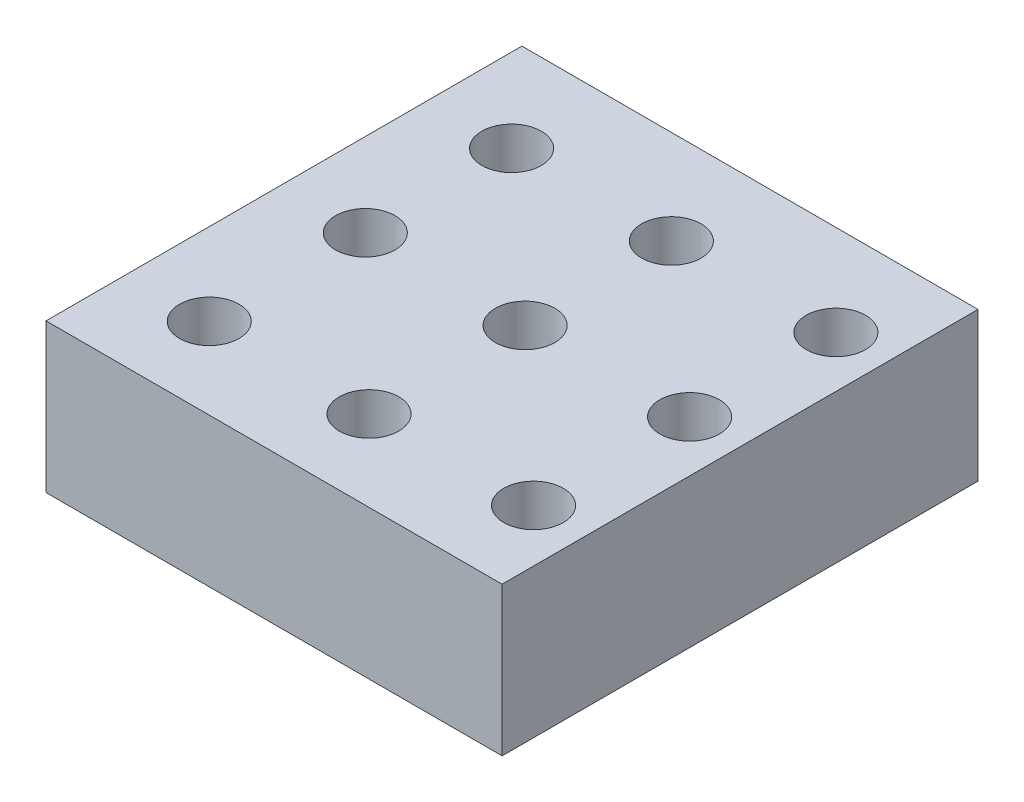
ISO-10303-21;
HEADER;
FILE_DESCRIPTION(('STEP AP214'),'2;1');
FILE_NAME('part.step','',(''),(''),'','','');
FILE_SCHEMA(('AUTOMOTIVE_DESIGN { 1 0 10303 214 1 1 1 1 }'));
ENDSEC;
DATA;
#1=APPLICATION_CONTEXT('core data for automotive mechanical design processes');
#2=APPLICATION_PROTOCOL_DEFINITION('international standard','automotive_design',2000,#1);
#3=PRODUCT_CONTEXT('',#1,'mechanical');
#4=PRODUCT('Part','Part','',(#3));
#5=PRODUCT_RELATED_PRODUCT_CATEGORY('part','',(#4));
#6=PRODUCT_DEFINITION_FORMATION('','',#4);
#7=PRODUCT_DEFINITION_CONTEXT('part definition',#1,'design');
#8=PRODUCT_DEFINITION('design','',#6,#7);
#9=PRODUCT_DEFINITION_SHAPE('','',#8);
#10=(LENGTH_UNIT() NAMED_UNIT(*) SI_UNIT(.MILLI.,.METRE.));
#11=(NAMED_UNIT(*) PLANE_ANGLE_UNIT() SI_UNIT($,.RADIAN.));
#12=(NAMED_UNIT(*) SI_UNIT($,.STERADIAN.) SOLID_ANGLE_UNIT());
#13=UNCERTAINTY_MEASURE_WITH_UNIT(LENGTH_MEASURE(1.E-05),#10,'distance_accuracy_value','');
#14=(GEOMETRIC_REPRESENTATION_CONTEXT(3) GLOBAL_UNCERTAINTY_ASSIGNED_CONTEXT((#13)) GLOBAL_UNIT_ASSIGNED_CONTEXT((#10,
#11,#12)) REPRESENTATION_CONTEXT('',''));
#15=CARTESIAN_POINT('',(0.,0.,0.));
#16=DIRECTION('',(0.,0.,1.));
#17=DIRECTION('',(1.,0.,0.));
#18=AXIS2_PLACEMENT_3D('',#15,#16,#17);
#19=CARTESIAN_POINT('',(0.,10.,0.));
#20=DIRECTION('',(0.,1.,0.));
#21=DIRECTION('',(0.,0.,1.));
#22=AXIS2_PLACEMENT_3D('',#19,#20,#21);
#23=PLANE('',#22);
#24=CARTESIAN_POINT('',(27.2286919016262,10.,15.9527247855204));
#25=DIRECTION('',(0.,1.,0.));
#26=DIRECTION('',(0.,0.,1.));
#27=AXIS2_PLACEMENT_3D('',#24,#25,#26);
#28=CIRCLE('',#27,2.00000000000001);
#29=CARTESIAN_POINT('',(27.2286919016262,10.,17.9527247855204));
#30=VERTEX_POINT('',#29);
#31=EDGE_CURVE('E151',#30,#30,#28,.T.);
#32=ORIENTED_EDGE('',*,*,#31,.F.);
#33=EDGE_LOOP('',(#32));
#34=FACE_BOUND('',#33,.T.);
#35=CARTESIAN_POINT('',(16.2814318917545,10.,26.5604646423789));
#36=DIRECTION('',(0.,1.,0.));
#37=DIRECTION('',(0.,0.,1.));
#38=AXIS2_PLACEMENT_3D('',#35,#36,#37);
#39=CIRCLE('',#38,2.00000000000001);
#40=CARTESIAN_POINT('',(16.2814318917545,10.,28.5604646423789));
#41=VERTEX_POINT('',#40);
#42=EDGE_CURVE('E139',#41,#41,#39,.T.);
#43=ORIENTED_EDGE('',*,*,#42,.F.);
#44=EDGE_LOOP('',(#43));
#45=FACE_BOUND('',#44,.T.);
#46=CARTESIAN_POINT('',(16.3716247773735,10.,6.32236886512236));
#47=DIRECTION('',(0.,1.,0.));
#48=DIRECTION('',(0.,0.,1.));
#49=AXIS2_PLACEMENT_3D('',#46,#47,#48);
#50=CIRCLE('',#49,2.);
#51=CARTESIAN_POINT('',(16.3716247773735,10.,8.32236886512236));
#52=VERTEX_POINT('',#51);
#53=EDGE_CURVE('E127',#52,#52,#50,.T.);
#54=ORIENTED_EDGE('',*,*,#53,.F.);
#55=EDGE_LOOP('',(#54));
#56=FACE_BOUND('',#55,.T.);
#57=CARTESIAN_POINT('',(5.60735533962495,10.,16.1363969737126));
#58=DIRECTION('',(0.,1.,0.));
#59=DIRECTION('',(0.,0.,1.));
#60=AXIS2_PLACEMENT_3D('',#57,#58,#59);
#61=CIRCLE('',#60,2.);
#62=CARTESIAN_POINT('',(5.60735533962495,10.,18.1363969737126));
#63=VERTEX_POINT('',#62);
#64=EDGE_CURVE('E115',#63,#63,#61,.T.);
#65=ORIENTED_EDGE('',*,*,#64,.F.);
#66=EDGE_LOOP('',(#65));
#67=FACE_BOUND('',#66,.T.);
#68=DIRECTION('',(0.,0.,1.));
#69=VECTOR('',#68,1.);
#70=CARTESIAN_POINT('',(0.,10.,0.));
#71=LINE('',#70,#69);
#72=CARTESIAN_POINT('',(0.,10.,0.));
#73=VERTEX_POINT('',#72);
#74=CARTESIAN_POINT('',(0.,10.,32.));
#75=VERTEX_POINT('',#74);
#76=EDGE_CURVE('E85',#73,#75,#71,.T.);
#77=ORIENTED_EDGE('',*,*,#76,.T.);
#78=DIRECTION('',(1.,0.,0.));
#79=VECTOR('',#78,1.);
#80=CARTESIAN_POINT('',(0.,10.,32.));
#81=LINE('',#80,#79);
#82=CARTESIAN_POINT('',(30.6675905123656,10.,32.));
#83=VERTEX_POINT('',#82);
#84=EDGE_CURVE('E80',#75,#83,#81,.T.);
#85=ORIENTED_EDGE('',*,*,#84,.T.);
#86=DIRECTION('',(0.,0.,-1.));
#87=VECTOR('',#86,1.);
#88=CARTESIAN_POINT('',(30.6675905123656,10.,0.));
#89=LINE('',#88,#87);
#90=CARTESIAN_POINT('',(30.6675905123656,10.,0.));
#91=VERTEX_POINT('',#90);
#92=EDGE_CURVE('E83',#83,#91,#89,.T.);
#93=ORIENTED_EDGE('',*,*,#92,.T.);
#94=DIRECTION('',(-1.,0.,0.));
#95=VECTOR('',#94,1.);
#96=CARTESIAN_POINT('',(0.,10.,0.));
#97=LINE('',#96,#95);
#98=EDGE_CURVE('E50',#91,#73,#97,.T.);
#99=ORIENTED_EDGE('',*,*,#98,.T.);
#100=EDGE_LOOP('',(#77,#85,#93,#99));
#101=FACE_BOUND('',#100,.T.);
#102=CARTESIAN_POINT('',(5.60735533962495,10.,6.3019608442121));
#103=DIRECTION('',(0.,1.,0.));
#104=DIRECTION('',(0.,0.,1.));
#105=AXIS2_PLACEMENT_3D('',#102,#103,#104);
#106=CIRCLE('',#105,2.);
#107=CARTESIAN_POINT('',(5.60735533962495,10.,8.30196084421211));
#108=VERTEX_POINT('',#107);
#109=EDGE_CURVE('E100',#108,#108,#106,.T.);
#110=ORIENTED_EDGE('',*,*,#109,.F.);
#111=EDGE_LOOP('',(#110));
#112=FACE_BOUND('',#111,.T.);
#113=CARTESIAN_POINT('',(5.51716245400601,10.,26.5400566214687));
#114=DIRECTION('',(0.,1.,0.));
#115=DIRECTION('',(0.,0.,1.));
#116=AXIS2_PLACEMENT_3D('',#113,#114,#115);
#117=CIRCLE('',#116,2.);
#118=CARTESIAN_POINT('',(5.51716245400601,10.,28.5400566214687));
#119=VERTEX_POINT('',#118);
#120=EDGE_CURVE('E121',#119,#119,#117,.T.);
#121=ORIENTED_EDGE('',*,*,#120,.F.);
#122=EDGE_LOOP('',(#121));
#123=FACE_BOUND('',#122,.T.);
#124=CARTESIAN_POINT('',(16.3716247773735,10.,16.1568049946229));
#125=DIRECTION('',(0.,1.,0.));
#126=DIRECTION('',(0.,0.,1.));
#127=AXIS2_PLACEMENT_3D('',#124,#125,#126);
#128=CIRCLE('',#127,2.);
#129=CARTESIAN_POINT('',(16.3716247773735,10.,18.1568049946229));
#130=VERTEX_POINT('',#129);
#131=EDGE_CURVE('E133',#130,#130,#128,.T.);
#132=ORIENTED_EDGE('',*,*,#131,.F.);
#133=EDGE_LOOP('',(#132));
#134=FACE_BOUND('',#133,.T.);
#135=CARTESIAN_POINT('',(27.2286919016262,10.,6.11828865601986));
#136=DIRECTION('',(0.,1.,0.));
#137=DIRECTION('',(0.,0.,1.));
#138=AXIS2_PLACEMENT_3D('',#135,#136,#137);
#139=CIRCLE('',#138,2.);
#140=CARTESIAN_POINT('',(27.2286919016262,10.,8.11828865601986));
#141=VERTEX_POINT('',#140);
#142=EDGE_CURVE('E145',#141,#141,#139,.T.);
#143=ORIENTED_EDGE('',*,*,#142,.F.);
#144=EDGE_LOOP('',(#143));
#145=FACE_BOUND('',#144,.T.);
#146=CARTESIAN_POINT('',(27.1384990160073,10.,26.3563844332764));
#147=DIRECTION('',(0.,1.,0.));
#148=DIRECTION('',(0.,0.,1.));
#149=AXIS2_PLACEMENT_3D('',#146,#147,#148);
#150=CIRCLE('',#149,2.00000000000001);
#151=CARTESIAN_POINT('',(27.1384990160073,10.,28.3563844332764));
#152=VERTEX_POINT('',#151);
#153=EDGE_CURVE('E157',#152,#152,#150,.T.);
#154=ORIENTED_EDGE('',*,*,#153,.F.);
#155=EDGE_LOOP('',(#154));
#156=FACE_BOUND('',#155,.T.);
#157=ADVANCED_FACE('F33',(#34,#45,#56,#67,#101,#112,#123,#134,#145,#156),#23,.T.);
#158=CARTESIAN_POINT('',(0.,0.,0.));
#159=DIRECTION('',(0.,1.,0.));
#160=DIRECTION('',(0.,0.,1.));
#161=AXIS2_PLACEMENT_3D('',#158,#159,#160);
#162=PLANE('',#161);
#163=DIRECTION('',(0.,0.,1.));
#164=VECTOR('',#163,1.);
#165=CARTESIAN_POINT('',(0.,0.,0.));
#166=LINE('',#165,#164);
#167=CARTESIAN_POINT('',(0.,0.,0.));
#168=VERTEX_POINT('',#167);
#169=CARTESIAN_POINT('',(0.,0.,32.));
#170=VERTEX_POINT('',#169);
#171=EDGE_CURVE('E97',#168,#170,#166,.T.);
#172=ORIENTED_EDGE('',*,*,#171,.F.);
#173=DIRECTION('',(-1.,0.,0.));
#174=VECTOR('',#173,1.);
#175=CARTESIAN_POINT('',(0.,0.,0.));
#176=LINE('',#175,#174);
#177=CARTESIAN_POINT('',(30.6675905123656,0.,0.));
#178=VERTEX_POINT('',#177);
#179=EDGE_CURVE('E73',#178,#168,#176,.T.);
#180=ORIENTED_EDGE('',*,*,#179,.F.);
#181=DIRECTION('',(0.,0.,-1.));
#182=VECTOR('',#181,1.);
#183=CARTESIAN_POINT('',(30.6675905123656,0.,0.));
#184=LINE('',#183,#182);
#185=CARTESIAN_POINT('',(30.6675905123656,0.,32.));
#186=VERTEX_POINT('',#185);
#187=EDGE_CURVE('E67',#186,#178,#184,.T.);
#188=ORIENTED_EDGE('',*,*,#187,.F.);
#189=DIRECTION('',(1.,0.,0.));
#190=VECTOR('',#189,1.);
#191=CARTESIAN_POINT('',(0.,0.,32.));
#192=LINE('',#191,#190);
#193=EDGE_CURVE('E89',#170,#186,#192,.T.);
#194=ORIENTED_EDGE('',*,*,#193,.F.);
#195=EDGE_LOOP('',(#172,#180,#188,#194));
#196=FACE_BOUND('',#195,.T.);
#197=CARTESIAN_POINT('',(5.60735533962495,0.,6.3019608442121));
#198=DIRECTION('',(0.,1.,0.));
#199=DIRECTION('',(0.,0.,1.));
#200=AXIS2_PLACEMENT_3D('',#197,#198,#199);
#201=CIRCLE('',#200,2.);
#202=CARTESIAN_POINT('',(5.60735533962495,0.,8.30196084421211));
#203=VERTEX_POINT('',#202);
#204=EDGE_CURVE('E112',#203,#203,#201,.T.);
#205=ORIENTED_EDGE('',*,*,#204,.T.);
#206=EDGE_LOOP('',(#205));
#207=FACE_BOUND('',#206,.T.);
#208=CARTESIAN_POINT('',(5.60735533962495,0.,16.1363969737126));
#209=DIRECTION('',(0.,1.,0.));
#210=DIRECTION('',(0.,0.,1.));
#211=AXIS2_PLACEMENT_3D('',#208,#209,#210);
#212=CIRCLE('',#211,2.);
#213=CARTESIAN_POINT('',(5.60735533962495,0.,18.1363969737126));
#214=VERTEX_POINT('',#213);
#215=EDGE_CURVE('E118',#214,#214,#212,.T.);
#216=ORIENTED_EDGE('',*,*,#215,.T.);
#217=EDGE_LOOP('',(#216));
#218=FACE_BOUND('',#217,.T.);
#219=CARTESIAN_POINT('',(5.51716245400601,0.,26.5400566214687));
#220=DIRECTION('',(0.,1.,0.));
#221=DIRECTION('',(0.,0.,1.));
#222=AXIS2_PLACEMENT_3D('',#219,#220,#221);
#223=CIRCLE('',#222,2.);
#224=CARTESIAN_POINT('',(5.51716245400601,0.,28.5400566214687));
#225=VERTEX_POINT('',#224);
#226=EDGE_CURVE('E124',#225,#225,#223,.T.);
#227=ORIENTED_EDGE('',*,*,#226,.T.);
#228=EDGE_LOOP('',(#227));
#229=FACE_BOUND('',#228,.T.);
#230=CARTESIAN_POINT('',(16.3716247773735,0.,6.32236886512236));
#231=DIRECTION('',(0.,1.,0.));
#232=DIRECTION('',(0.,0.,1.));
#233=AXIS2_PLACEMENT_3D('',#230,#231,#232);
#234=CIRCLE('',#233,2.);
#235=CARTESIAN_POINT('',(16.3716247773735,0.,8.32236886512236));
#236=VERTEX_POINT('',#235);
#237=EDGE_CURVE('E130',#236,#236,#234,.T.);
#238=ORIENTED_EDGE('',*,*,#237,.T.);
#239=EDGE_LOOP('',(#238));
#240=FACE_BOUND('',#239,.T.);
#241=CARTESIAN_POINT('',(16.3716247773735,0.,16.1568049946229));
#242=DIRECTION('',(0.,1.,0.));
#243=DIRECTION('',(0.,0.,1.));
#244=AXIS2_PLACEMENT_3D('',#241,#242,#243);
#245=CIRCLE('',#244,2.);
#246=CARTESIAN_POINT('',(16.3716247773735,0.,18.1568049946229));
#247=VERTEX_POINT('',#246);
#248=EDGE_CURVE('E136',#247,#247,#245,.T.);
#249=ORIENTED_EDGE('',*,*,#248,.T.);
#250=EDGE_LOOP('',(#249));
#251=FACE_BOUND('',#250,.T.);
#252=CARTESIAN_POINT('',(16.2814318917545,0.,26.5604646423789));
#253=DIRECTION('',(0.,1.,0.));
#254=DIRECTION('',(0.,0.,1.));
#255=AXIS2_PLACEMENT_3D('',#252,#253,#254);
#256=CIRCLE('',#255,2.00000000000001);
#257=CARTESIAN_POINT('',(16.2814318917545,0.,28.5604646423789));
#258=VERTEX_POINT('',#257);
#259=EDGE_CURVE('E142',#258,#258,#256,.T.);
#260=ORIENTED_EDGE('',*,*,#259,.T.);
#261=EDGE_LOOP('',(#260));
#262=FACE_BOUND('',#261,.T.);
#263=CARTESIAN_POINT('',(27.2286919016262,0.,6.11828865601986));
#264=DIRECTION('',(0.,1.,0.));
#265=DIRECTION('',(0.,0.,1.));
#266=AXIS2_PLACEMENT_3D('',#263,#264,#265);
#267=CIRCLE('',#266,2.);
#268=CARTESIAN_POINT('',(27.2286919016262,0.,8.11828865601986));
#269=VERTEX_POINT('',#268);
#270=EDGE_CURVE('E148',#269,#269,#267,.T.);
#271=ORIENTED_EDGE('',*,*,#270,.T.);
#272=EDGE_LOOP('',(#271));
#273=FACE_BOUND('',#272,.T.);
#274=CARTESIAN_POINT('',(27.2286919016262,0.,15.9527247855204));
#275=DIRECTION('',(0.,1.,0.));
#276=DIRECTION('',(0.,0.,1.));
#277=AXIS2_PLACEMENT_3D('',#274,#275,#276);
#278=CIRCLE('',#277,2.00000000000001);
#279=CARTESIAN_POINT('',(27.2286919016262,0.,17.9527247855204));
#280=VERTEX_POINT('',#279);
#281=EDGE_CURVE('E154',#280,#280,#278,.T.);
#282=ORIENTED_EDGE('',*,*,#281,.T.);
#283=EDGE_LOOP('',(#282));
#284=FACE_BOUND('',#283,.T.);
#285=CARTESIAN_POINT('',(27.1384990160073,0.,26.3563844332764));
#286=DIRECTION('',(0.,1.,0.));
#287=DIRECTION('',(0.,0.,1.));
#288=AXIS2_PLACEMENT_3D('',#285,#286,#287);
#289=CIRCLE('',#288,2.00000000000001);
#290=CARTESIAN_POINT('',(27.1384990160073,0.,28.3563844332764));
#291=VERTEX_POINT('',#290);
#292=EDGE_CURVE('E160',#291,#291,#289,.T.);
#293=ORIENTED_EDGE('',*,*,#292,.T.);
#294=EDGE_LOOP('',(#293));
#295=FACE_BOUND('',#294,.T.);
#296=ADVANCED_FACE('F108',(#196,#207,#218,#229,#240,#251,#262,#273,#284,#295),#162,.F.);
#297=CARTESIAN_POINT('',(0.,10.,0.));
#298=DIRECTION('',(1.,0.,0.));
#299=DIRECTION('',(0.,0.,-1.));
#300=AXIS2_PLACEMENT_3D('',#297,#298,#299);
#301=PLANE('',#300);
#302=ORIENTED_EDGE('',*,*,#171,.T.);
#303=DIRECTION('',(0.,-1.,0.));
#304=VECTOR('',#303,1.);
#305=CARTESIAN_POINT('',(0.,10.,32.));
#306=LINE('',#305,#304);
#307=EDGE_CURVE('E11',#75,#170,#306,.T.);
#308=ORIENTED_EDGE('',*,*,#307,.F.);
#309=ORIENTED_EDGE('',*,*,#76,.F.);
#310=DIRECTION('',(0.,-1.,0.));
#311=VECTOR('',#310,1.);
#312=CARTESIAN_POINT('',(0.,10.,0.));
#313=LINE('',#312,#311);
#314=EDGE_CURVE('E93',#73,#168,#313,.T.);
#315=ORIENTED_EDGE('',*,*,#314,.T.);
#316=EDGE_LOOP('',(#302,#308,#309,#315));
#317=FACE_BOUND('',#316,.T.);
#318=ADVANCED_FACE('F35',(#317),#301,.F.);
#319=CARTESIAN_POINT('',(0.,10.,32.));
#320=DIRECTION('',(0.,0.,-1.));
#321=DIRECTION('',(-1.,0.,0.));
#322=AXIS2_PLACEMENT_3D('',#319,#320,#321);
#323=PLANE('',#322);
#324=ORIENTED_EDGE('',*,*,#193,.T.);
#325=DIRECTION('',(0.,-1.,0.));
#326=VECTOR('',#325,1.);
#327=CARTESIAN_POINT('',(30.6675905123656,10.,32.));
#328=LINE('',#327,#326);
#329=EDGE_CURVE('E42',#83,#186,#328,.T.);
#330=ORIENTED_EDGE('',*,*,#329,.F.);
#331=ORIENTED_EDGE('',*,*,#84,.F.);
#332=ORIENTED_EDGE('',*,*,#307,.T.);
#333=EDGE_LOOP('',(#324,#330,#331,#332));
#334=FACE_BOUND('',#333,.T.);
#335=ADVANCED_FACE('F88',(#334),#323,.F.);
#336=CARTESIAN_POINT('',(30.6675905123656,10.,0.));
#337=DIRECTION('',(-1.,0.,0.));
#338=DIRECTION('',(0.,0.,1.));
#339=AXIS2_PLACEMENT_3D('',#336,#337,#338);
#340=PLANE('',#339);
#341=ORIENTED_EDGE('',*,*,#187,.T.);
#342=DIRECTION('',(0.,-1.,0.));
#343=VECTOR('',#342,1.);
#344=CARTESIAN_POINT('',(30.6675905123656,10.,0.));
#345=LINE('',#344,#343);
#346=EDGE_CURVE('E90',#91,#178,#345,.T.);
#347=ORIENTED_EDGE('',*,*,#346,.F.);
#348=ORIENTED_EDGE('',*,*,#92,.F.);
#349=ORIENTED_EDGE('',*,*,#329,.T.);
#350=EDGE_LOOP('',(#341,#347,#348,#349));
#351=FACE_BOUND('',#350,.T.);
#352=ADVANCED_FACE('F91',(#351),#340,.F.);
#353=CARTESIAN_POINT('',(0.,10.,0.));
#354=DIRECTION('',(0.,0.,1.));
#355=DIRECTION('',(1.,0.,0.));
#356=AXIS2_PLACEMENT_3D('',#353,#354,#355);
#357=PLANE('',#356);
#358=ORIENTED_EDGE('',*,*,#179,.T.);
#359=ORIENTED_EDGE('',*,*,#314,.F.);
#360=ORIENTED_EDGE('',*,*,#98,.F.);
#361=ORIENTED_EDGE('',*,*,#346,.T.);
#362=EDGE_LOOP('',(#358,#359,#360,#361));
#363=FACE_BOUND('',#362,.T.);
#364=ADVANCED_FACE('F105',(#363),#357,.F.);
#365=CARTESIAN_POINT('',(5.60735533962495,10.,6.3019608442121));
#366=DIRECTION('',(0.,-1.,0.));
#367=DIRECTION('',(0.,0.,-1.));
#368=AXIS2_PLACEMENT_3D('',#365,#366,#367);
#369=CYLINDRICAL_SURFACE('',#368,2.);
#370=ORIENTED_EDGE('',*,*,#109,.T.);
#371=EDGE_LOOP('',(#370));
#372=FACE_BOUND('',#371,.T.);
#373=ORIENTED_EDGE('',*,*,#204,.F.);
#374=EDGE_LOOP('',(#373));
#375=FACE_BOUND('',#374,.T.);
#376=ADVANCED_FACE('F179',(#372,#375),#369,.F.);
#377=CARTESIAN_POINT('',(5.60735533962495,10.,16.1363969737126));
#378=DIRECTION('',(0.,-1.,0.));
#379=DIRECTION('',(0.,0.,-1.));
#380=AXIS2_PLACEMENT_3D('',#377,#378,#379);
#381=CYLINDRICAL_SURFACE('',#380,2.);
#382=ORIENTED_EDGE('',*,*,#64,.T.);
#383=EDGE_LOOP('',(#382));
#384=FACE_BOUND('',#383,.T.);
#385=ORIENTED_EDGE('',*,*,#215,.F.);
#386=EDGE_LOOP('',(#385));
#387=FACE_BOUND('',#386,.T.);
#388=ADVANCED_FACE('F225',(#384,#387),#381,.F.);
#389=CARTESIAN_POINT('',(5.51716245400601,10.,26.5400566214687));
#390=DIRECTION('',(0.,-1.,0.));
#391=DIRECTION('',(0.,0.,-1.));
#392=AXIS2_PLACEMENT_3D('',#389,#390,#391);
#393=CYLINDRICAL_SURFACE('',#392,2.);
#394=ORIENTED_EDGE('',*,*,#120,.T.);
#395=EDGE_LOOP('',(#394));
#396=FACE_BOUND('',#395,.T.);
#397=ORIENTED_EDGE('',*,*,#226,.F.);
#398=EDGE_LOOP('',(#397));
#399=FACE_BOUND('',#398,.T.);
#400=ADVANCED_FACE('F233',(#396,#399),#393,.F.);
#401=CARTESIAN_POINT('',(16.3716247773735,10.,6.32236886512236));
#402=DIRECTION('',(0.,-1.,0.));
#403=DIRECTION('',(0.,0.,-1.));
#404=AXIS2_PLACEMENT_3D('',#401,#402,#403);
#405=CYLINDRICAL_SURFACE('',#404,2.);
#406=ORIENTED_EDGE('',*,*,#53,.T.);
#407=EDGE_LOOP('',(#406));
#408=FACE_BOUND('',#407,.T.);
#409=ORIENTED_EDGE('',*,*,#237,.F.);
#410=EDGE_LOOP('',(#409));
#411=FACE_BOUND('',#410,.T.);
#412=ADVANCED_FACE('F241',(#408,#411),#405,.F.);
#413=CARTESIAN_POINT('',(16.3716247773735,10.,16.1568049946229));
#414=DIRECTION('',(0.,-1.,0.));
#415=DIRECTION('',(0.,0.,-1.));
#416=AXIS2_PLACEMENT_3D('',#413,#414,#415);
#417=CYLINDRICAL_SURFACE('',#416,2.);
#418=ORIENTED_EDGE('',*,*,#131,.T.);
#419=EDGE_LOOP('',(#418));
#420=FACE_BOUND('',#419,.T.);
#421=ORIENTED_EDGE('',*,*,#248,.F.);
#422=EDGE_LOOP('',(#421));
#423=FACE_BOUND('',#422,.T.);
#424=ADVANCED_FACE('F250',(#420,#423),#417,.F.);
#425=CARTESIAN_POINT('',(16.2814318917545,10.,26.5604646423789));
#426=DIRECTION('',(0.,-1.,0.));
#427=DIRECTION('',(0.,0.,-1.));
#428=AXIS2_PLACEMENT_3D('',#425,#426,#427);
#429=CYLINDRICAL_SURFACE('',#428,2.00000000000001);
#430=ORIENTED_EDGE('',*,*,#42,.T.);
#431=EDGE_LOOP('',(#430));
#432=FACE_BOUND('',#431,.T.);
#433=ORIENTED_EDGE('',*,*,#259,.F.);
#434=EDGE_LOOP('',(#433));
#435=FACE_BOUND('',#434,.T.);
#436=ADVANCED_FACE('F259',(#432,#435),#429,.F.);
#437=CARTESIAN_POINT('',(27.2286919016262,10.,6.11828865601986));
#438=DIRECTION('',(0.,-1.,0.));
#439=DIRECTION('',(0.,0.,-1.));
#440=AXIS2_PLACEMENT_3D('',#437,#438,#439);
#441=CYLINDRICAL_SURFACE('',#440,2.);
#442=ORIENTED_EDGE('',*,*,#142,.T.);
#443=EDGE_LOOP('',(#442));
#444=FACE_BOUND('',#443,.T.);
#445=ORIENTED_EDGE('',*,*,#270,.F.);
#446=EDGE_LOOP('',(#445));
#447=FACE_BOUND('',#446,.T.);
#448=ADVANCED_FACE('F268',(#444,#447),#441,.F.);
#449=CARTESIAN_POINT('',(27.2286919016262,10.,15.9527247855204));
#450=DIRECTION('',(0.,-1.,0.));
#451=DIRECTION('',(0.,0.,-1.));
#452=AXIS2_PLACEMENT_3D('',#449,#450,#451);
#453=CYLINDRICAL_SURFACE('',#452,2.00000000000001);
#454=ORIENTED_EDGE('',*,*,#31,.T.);
#455=EDGE_LOOP('',(#454));
#456=FACE_BOUND('',#455,.T.);
#457=ORIENTED_EDGE('',*,*,#281,.F.);
#458=EDGE_LOOP('',(#457));
#459=FACE_BOUND('',#458,.T.);
#460=ADVANCED_FACE('F277',(#456,#459),#453,.F.);
#461=CARTESIAN_POINT('',(27.1384990160073,10.,26.3563844332764));
#462=DIRECTION('',(0.,-1.,0.));
#463=DIRECTION('',(0.,0.,-1.));
#464=AXIS2_PLACEMENT_3D('',#461,#462,#463);
#465=CYLINDRICAL_SURFACE('',#464,2.00000000000001);
#466=ORIENTED_EDGE('',*,*,#153,.T.);
#467=EDGE_LOOP('',(#466));
#468=FACE_BOUND('',#467,.T.);
#469=ORIENTED_EDGE('',*,*,#292,.F.);
#470=EDGE_LOOP('',(#469));
#471=FACE_BOUND('',#470,.T.);
#472=ADVANCED_FACE('F166',(#468,#471),#465,.F.);
#473=CLOSED_SHELL('',(#157,#296,#318,#335,#352,#364,#376,#388,#400,#412,#424,#436,#448,#460,#472));
#474=MANIFOLD_SOLID_BREP('B2',#473);
#475=ADVANCED_BREP_SHAPE_REPRESENTATION('',(#18,#474),#14);
#476=SHAPE_DEFINITION_REPRESENTATION(#9,#475);
ENDSEC;
END-ISO-10303-21;
